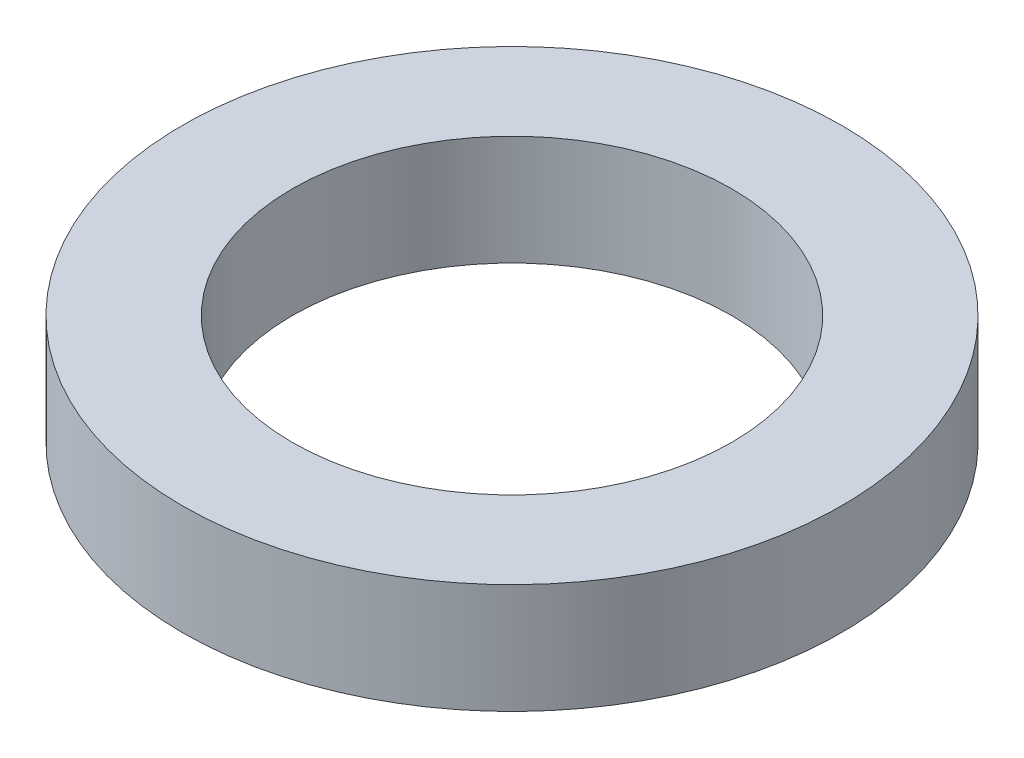
ISO-10303-21;
HEADER;
FILE_DESCRIPTION(('STEP AP214'),'2;1');
FILE_NAME('part.step','',(''),(''),'','','');
FILE_SCHEMA(('AUTOMOTIVE_DESIGN { 1 0 10303 214 1 1 1 1 }'));
ENDSEC;
DATA;
#1=APPLICATION_CONTEXT('core data for automotive mechanical design processes');
#2=APPLICATION_PROTOCOL_DEFINITION('international standard','automotive_design',2000,#1);
#3=PRODUCT_CONTEXT('',#1,'mechanical');
#4=PRODUCT('Part','Part','',(#3));
#5=PRODUCT_RELATED_PRODUCT_CATEGORY('part','',(#4));
#6=PRODUCT_DEFINITION_FORMATION('','',#4);
#7=PRODUCT_DEFINITION_CONTEXT('part definition',#1,'design');
#8=PRODUCT_DEFINITION('design','',#6,#7);
#9=PRODUCT_DEFINITION_SHAPE('','',#8);
#10=(LENGTH_UNIT() NAMED_UNIT(*) SI_UNIT(.MILLI.,.METRE.));
#11=(NAMED_UNIT(*) PLANE_ANGLE_UNIT() SI_UNIT($,.RADIAN.));
#12=(NAMED_UNIT(*) SI_UNIT($,.STERADIAN.) SOLID_ANGLE_UNIT());
#13=UNCERTAINTY_MEASURE_WITH_UNIT(LENGTH_MEASURE(1.E-05),#10,'distance_accuracy_value','');
#14=(GEOMETRIC_REPRESENTATION_CONTEXT(3) GLOBAL_UNCERTAINTY_ASSIGNED_CONTEXT((#13)) GLOBAL_UNIT_ASSIGNED_CONTEXT((#10,
#11,#12)) REPRESENTATION_CONTEXT('',''));
#15=CARTESIAN_POINT('',(0.,0.,0.));
#16=DIRECTION('',(0.,0.,1.));
#17=DIRECTION('',(1.,0.,0.));
#18=AXIS2_PLACEMENT_3D('',#15,#16,#17);
#19=CARTESIAN_POINT('',(4.7625,1.5875,0.));
#20=DIRECTION('',(0.,1.,0.));
#21=DIRECTION('',(0.,0.,1.));
#22=AXIS2_PLACEMENT_3D('',#19,#20,#21);
#23=PLANE('',#22);
#24=CARTESIAN_POINT('',(0.,1.5875,0.));
#25=DIRECTION('',(0.,-1.,0.));
#26=DIRECTION('',(0.,0.,-1.));
#27=AXIS2_PLACEMENT_3D('',#24,#25,#26);
#28=CIRCLE('',#27,3.175);
#29=CARTESIAN_POINT('',(0.,1.5875,-3.175));
#30=VERTEX_POINT('',#29);
#31=EDGE_CURVE('E10',#30,#30,#28,.T.);
#32=ORIENTED_EDGE('',*,*,#31,.T.);
#33=EDGE_LOOP('',(#32));
#34=FACE_BOUND('',#33,.T.);
#35=CARTESIAN_POINT('',(0.,1.5875,0.));
#36=DIRECTION('',(0.,-1.,0.));
#37=DIRECTION('',(0.,0.,-1.));
#38=AXIS2_PLACEMENT_3D('',#35,#36,#37);
#39=CIRCLE('',#38,4.7625);
#40=CARTESIAN_POINT('',(0.,1.5875,-4.7625));
#41=VERTEX_POINT('',#40);
#42=EDGE_CURVE('E47',#41,#41,#39,.T.);
#43=ORIENTED_EDGE('',*,*,#42,.F.);
#44=EDGE_LOOP('',(#43));
#45=FACE_BOUND('',#44,.T.);
#46=ADVANCED_FACE('F33',(#34,#45),#23,.T.);
#47=CARTESIAN_POINT('',(0.,1.5875,0.));
#48=DIRECTION('',(0.,-1.,0.));
#49=DIRECTION('',(0.,0.,-1.));
#50=AXIS2_PLACEMENT_3D('',#47,#48,#49);
#51=CYLINDRICAL_SURFACE('',#50,3.175);
#52=CARTESIAN_POINT('',(0.,0.,0.));
#53=DIRECTION('',(0.,-1.,0.));
#54=DIRECTION('',(0.,0.,-1.));
#55=AXIS2_PLACEMENT_3D('',#52,#53,#54);
#56=CIRCLE('',#55,3.175);
#57=CARTESIAN_POINT('',(0.,0.,-3.175));
#58=VERTEX_POINT('',#57);
#59=EDGE_CURVE('E39',#58,#58,#56,.T.);
#60=ORIENTED_EDGE('',*,*,#59,.T.);
#61=EDGE_LOOP('',(#60));
#62=FACE_BOUND('',#61,.T.);
#63=ORIENTED_EDGE('',*,*,#31,.F.);
#64=EDGE_LOOP('',(#63));
#65=FACE_BOUND('',#64,.T.);
#66=ADVANCED_FACE('F57',(#62,#65),#51,.F.);
#67=CARTESIAN_POINT('',(3.175,0.,0.));
#68=DIRECTION('',(0.,-1.,0.));
#69=DIRECTION('',(0.,0.,-1.));
#70=AXIS2_PLACEMENT_3D('',#67,#68,#69);
#71=PLANE('',#70);
#72=CARTESIAN_POINT('',(0.,0.,0.));
#73=DIRECTION('',(0.,-1.,0.));
#74=DIRECTION('',(0.,0.,-1.));
#75=AXIS2_PLACEMENT_3D('',#72,#73,#74);
#76=CIRCLE('',#75,4.7625);
#77=CARTESIAN_POINT('',(0.,0.,-4.7625));
#78=VERTEX_POINT('',#77);
#79=EDGE_CURVE('E43',#78,#78,#76,.T.);
#80=ORIENTED_EDGE('',*,*,#79,.T.);
#81=EDGE_LOOP('',(#80));
#82=FACE_BOUND('',#81,.T.);
#83=ORIENTED_EDGE('',*,*,#59,.F.);
#84=EDGE_LOOP('',(#83));
#85=FACE_BOUND('',#84,.T.);
#86=ADVANCED_FACE('F61',(#82,#85),#71,.T.);
#87=CARTESIAN_POINT('',(0.,1.5875,0.));
#88=DIRECTION('',(0.,-1.,0.));
#89=DIRECTION('',(0.,0.,-1.));
#90=AXIS2_PLACEMENT_3D('',#87,#88,#89);
#91=CYLINDRICAL_SURFACE('',#90,4.7625);
#92=ORIENTED_EDGE('',*,*,#42,.T.);
#93=EDGE_LOOP('',(#92));
#94=FACE_BOUND('',#93,.T.);
#95=ORIENTED_EDGE('',*,*,#79,.F.);
#96=EDGE_LOOP('',(#95));
#97=FACE_BOUND('',#96,.T.);
#98=ADVANCED_FACE('F53',(#94,#97),#91,.T.);
#99=CLOSED_SHELL('',(#46,#66,#86,#98));
#100=MANIFOLD_SOLID_BREP('B2',#99);
#101=ADVANCED_BREP_SHAPE_REPRESENTATION('',(#18,#100),#14);
#102=SHAPE_DEFINITION_REPRESENTATION(#9,#101);
ENDSEC;
END-ISO-10303-21;
